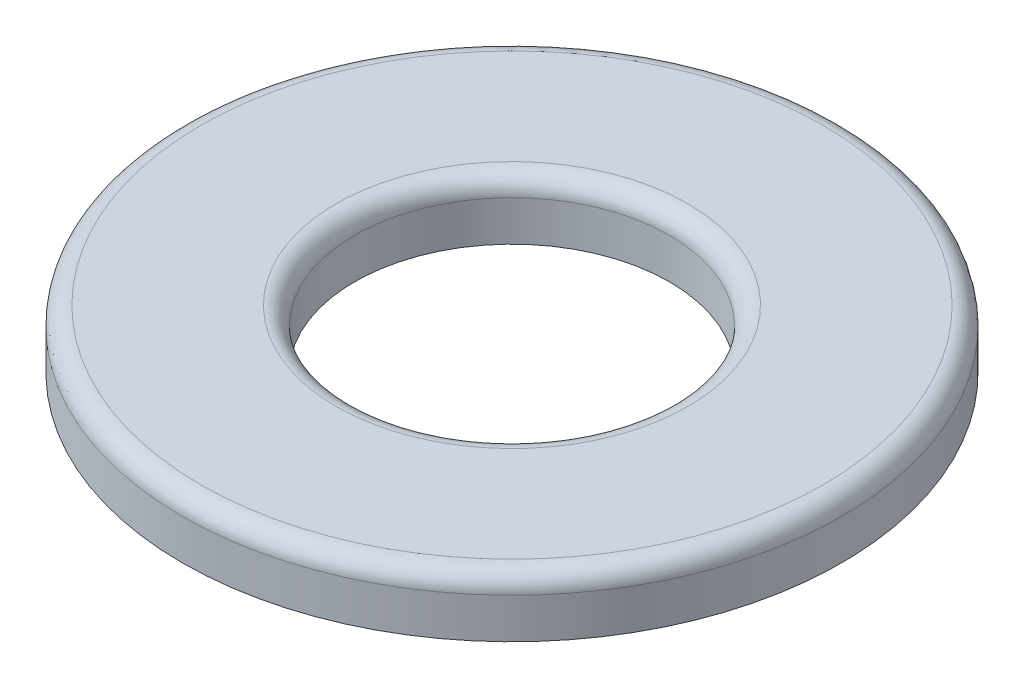
ISO-10303-21;
HEADER;
FILE_DESCRIPTION(('STEP AP214'),'2;1');
FILE_NAME('part.step','',(''),(''),'','','');
FILE_SCHEMA(('AUTOMOTIVE_DESIGN { 1 0 10303 214 1 1 1 1 }'));
ENDSEC;
DATA;
#1=APPLICATION_CONTEXT('core data for automotive mechanical design processes');
#2=APPLICATION_PROTOCOL_DEFINITION('international standard','automotive_design',2000,#1);
#3=PRODUCT_CONTEXT('',#1,'mechanical');
#4=PRODUCT('Part','Part','',(#3));
#5=PRODUCT_RELATED_PRODUCT_CATEGORY('part','',(#4));
#6=PRODUCT_DEFINITION_FORMATION('','',#4);
#7=PRODUCT_DEFINITION_CONTEXT('part definition',#1,'design');
#8=PRODUCT_DEFINITION('design','',#6,#7);
#9=PRODUCT_DEFINITION_SHAPE('','',#8);
#10=(LENGTH_UNIT() NAMED_UNIT(*) SI_UNIT(.MILLI.,.METRE.));
#11=(NAMED_UNIT(*) PLANE_ANGLE_UNIT() SI_UNIT($,.RADIAN.));
#12=(NAMED_UNIT(*) SI_UNIT($,.STERADIAN.) SOLID_ANGLE_UNIT());
#13=UNCERTAINTY_MEASURE_WITH_UNIT(LENGTH_MEASURE(1.E-05),#10,'distance_accuracy_value','');
#14=(GEOMETRIC_REPRESENTATION_CONTEXT(3) GLOBAL_UNCERTAINTY_ASSIGNED_CONTEXT((#13)) GLOBAL_UNIT_ASSIGNED_CONTEXT((#10,
#11,#12)) REPRESENTATION_CONTEXT('',''));
#15=CARTESIAN_POINT('',(0.,0.,0.));
#16=DIRECTION('',(0.,0.,1.));
#17=DIRECTION('',(1.,0.,0.));
#18=AXIS2_PLACEMENT_3D('',#15,#16,#17);
#19=CARTESIAN_POINT('',(0.,0.8,0.));
#20=DIRECTION('',(0.,1.,0.));
#21=DIRECTION('',(0.,0.,1.));
#22=AXIS2_PLACEMENT_3D('',#19,#20,#21);
#23=PLANE('',#22);
#24=CARTESIAN_POINT('',(0.,0.8,0.));
#25=DIRECTION('',(0.,1.,0.));
#26=DIRECTION('',(0.,0.,1.));
#27=AXIS2_PLACEMENT_3D('',#24,#25,#26);
#28=CIRCLE('',#27,2.4);
#29=CARTESIAN_POINT('',(0.,0.8,2.4));
#30=VERTEX_POINT('',#29);
#31=EDGE_CURVE('E48',#30,#30,#28,.F.);
#32=ORIENTED_EDGE('',*,*,#31,.T.);
#33=EDGE_LOOP('',(#32));
#34=FACE_BOUND('',#33,.T.);
#35=CARTESIAN_POINT('',(0.,0.8,0.));
#36=DIRECTION('',(0.,1.,0.));
#37=DIRECTION('',(0.,0.,1.));
#38=AXIS2_PLACEMENT_3D('',#35,#36,#37);
#39=CIRCLE('',#38,4.25);
#40=CARTESIAN_POINT('',(0.,0.8,4.25));
#41=VERTEX_POINT('',#40);
#42=EDGE_CURVE('E53',#41,#41,#39,.T.);
#43=ORIENTED_EDGE('',*,*,#42,.T.);
#44=EDGE_LOOP('',(#43));
#45=FACE_BOUND('',#44,.T.);
#46=ADVANCED_FACE('F40',(#34,#45),#23,.T.);
#47=CARTESIAN_POINT('',(0.,0.,0.));
#48=DIRECTION('',(0.,1.,0.));
#49=DIRECTION('',(0.,0.,1.));
#50=AXIS2_PLACEMENT_3D('',#47,#48,#49);
#51=PLANE('',#50);
#52=CARTESIAN_POINT('',(0.,0.,0.));
#53=DIRECTION('',(0.,1.,0.));
#54=DIRECTION('',(0.,0.,1.));
#55=AXIS2_PLACEMENT_3D('',#52,#53,#54);
#56=CIRCLE('',#55,4.5);
#57=CARTESIAN_POINT('',(0.,0.,4.5));
#58=VERTEX_POINT('',#57);
#59=EDGE_CURVE('E64',#58,#58,#56,.T.);
#60=ORIENTED_EDGE('',*,*,#59,.F.);
#61=EDGE_LOOP('',(#60));
#62=FACE_BOUND('',#61,.T.);
#63=CARTESIAN_POINT('',(0.,0.,0.));
#64=DIRECTION('',(0.,1.,0.));
#65=DIRECTION('',(0.,0.,1.));
#66=AXIS2_PLACEMENT_3D('',#63,#64,#65);
#67=CIRCLE('',#66,2.15);
#68=CARTESIAN_POINT('',(0.,0.,2.15));
#69=VERTEX_POINT('',#68);
#70=EDGE_CURVE('E68',#69,#69,#67,.T.);
#71=ORIENTED_EDGE('',*,*,#70,.T.);
#72=EDGE_LOOP('',(#71));
#73=FACE_BOUND('',#72,.T.);
#74=ADVANCED_FACE('F73',(#62,#73),#51,.F.);
#75=CARTESIAN_POINT('',(0.,0.8,0.));
#76=DIRECTION('',(0.,-1.,0.));
#77=DIRECTION('',(0.,0.,-1.));
#78=AXIS2_PLACEMENT_3D('',#75,#76,#77);
#79=CYLINDRICAL_SURFACE('',#78,4.5);
#80=CARTESIAN_POINT('',(0.,0.55,0.));
#81=DIRECTION('',(0.,1.,0.));
#82=DIRECTION('',(0.,0.,1.));
#83=AXIS2_PLACEMENT_3D('',#80,#81,#82);
#84=CIRCLE('',#83,4.5);
#85=CARTESIAN_POINT('',(0.,0.55,4.5));
#86=VERTEX_POINT('',#85);
#87=EDGE_CURVE('E10',#86,#86,#84,.F.);
#88=ORIENTED_EDGE('',*,*,#87,.T.);
#89=EDGE_LOOP('',(#88));
#90=FACE_BOUND('',#89,.T.);
#91=ORIENTED_EDGE('',*,*,#59,.T.);
#92=EDGE_LOOP('',(#91));
#93=FACE_BOUND('',#92,.T.);
#94=ADVANCED_FACE('F78',(#90,#93),#79,.T.);
#95=CARTESIAN_POINT('',(0.,0.8,0.));
#96=DIRECTION('',(0.,-1.,0.));
#97=DIRECTION('',(0.,0.,-1.));
#98=AXIS2_PLACEMENT_3D('',#95,#96,#97);
#99=CYLINDRICAL_SURFACE('',#98,2.15);
#100=CARTESIAN_POINT('',(0.,0.55,0.));
#101=DIRECTION('',(0.,1.,0.));
#102=DIRECTION('',(0.,0.,1.));
#103=AXIS2_PLACEMENT_3D('',#100,#101,#102);
#104=CIRCLE('',#103,2.15);
#105=CARTESIAN_POINT('',(0.,0.55,2.15));
#106=VERTEX_POINT('',#105);
#107=EDGE_CURVE('E58',#106,#106,#104,.T.);
#108=ORIENTED_EDGE('',*,*,#107,.T.);
#109=EDGE_LOOP('',(#108));
#110=FACE_BOUND('',#109,.T.);
#111=ORIENTED_EDGE('',*,*,#70,.F.);
#112=EDGE_LOOP('',(#111));
#113=FACE_BOUND('',#112,.T.);
#114=ADVANCED_FACE('F75',(#110,#113),#99,.F.);
#115=CARTESIAN_POINT('',(0.,0.55,0.));
#116=DIRECTION('',(0.,1.,0.));
#117=DIRECTION('',(0.,0.,1.));
#118=AXIS2_PLACEMENT_3D('',#115,#116,#117);
#119=TOROIDAL_SURFACE('',#118,2.4,0.25);
#120=ORIENTED_EDGE('',*,*,#31,.F.);
#121=EDGE_LOOP('',(#120));
#122=FACE_BOUND('',#121,.T.);
#123=ORIENTED_EDGE('',*,*,#107,.F.);
#124=EDGE_LOOP('',(#123));
#125=FACE_BOUND('',#124,.T.);
#126=ADVANCED_FACE('F77',(#122,#125),#119,.T.);
#127=CARTESIAN_POINT('',(0.,0.55,0.));
#128=DIRECTION('',(0.,1.,0.));
#129=DIRECTION('',(0.,0.,1.));
#130=AXIS2_PLACEMENT_3D('',#127,#128,#129);
#131=TOROIDAL_SURFACE('',#130,4.25,0.25);
#132=ORIENTED_EDGE('',*,*,#87,.F.);
#133=EDGE_LOOP('',(#132));
#134=FACE_BOUND('',#133,.T.);
#135=ORIENTED_EDGE('',*,*,#42,.F.);
#136=EDGE_LOOP('',(#135));
#137=FACE_BOUND('',#136,.T.);
#138=ADVANCED_FACE('F42',(#134,#137),#131,.T.);
#139=CLOSED_SHELL('',(#46,#74,#94,#114,#126,#138));
#140=MANIFOLD_SOLID_BREP('B2',#139);
#141=ADVANCED_BREP_SHAPE_REPRESENTATION('',(#18,#140),#14);
#142=SHAPE_DEFINITION_REPRESENTATION(#9,#141);
ENDSEC;
END-ISO-10303-21;
